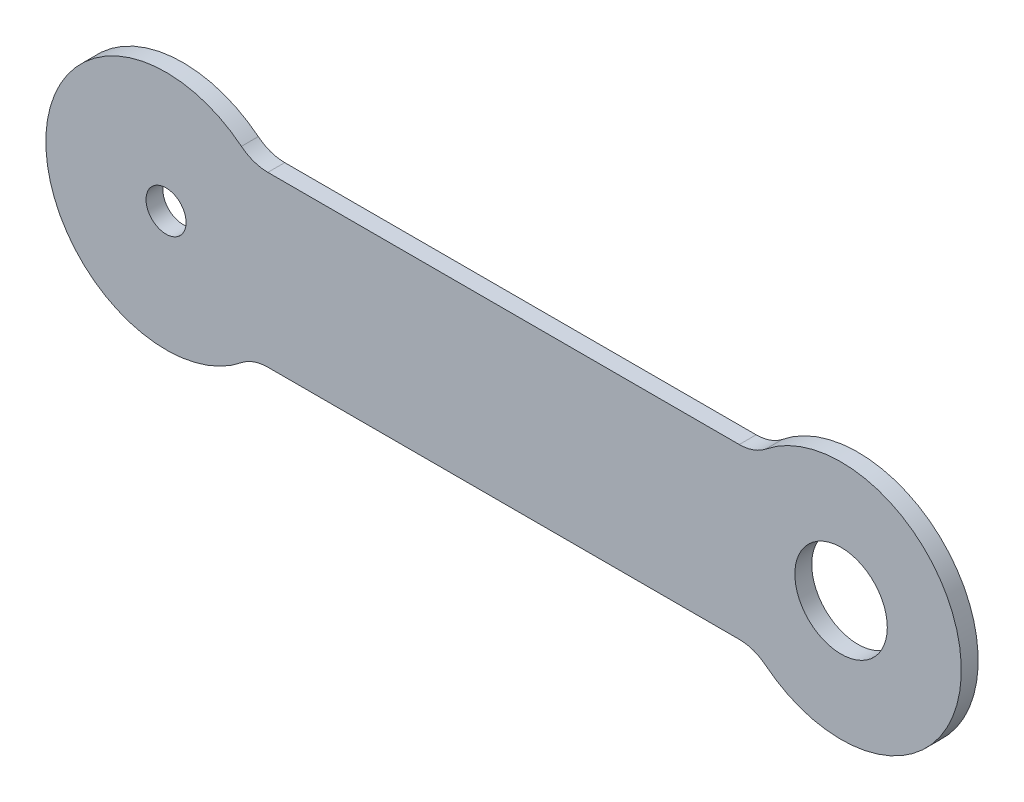
ISO-10303-21;
HEADER;
FILE_DESCRIPTION(('STEP AP214'),'2;1');
FILE_NAME('part.step','',(''),(''),'','','');
FILE_SCHEMA(('AUTOMOTIVE_DESIGN { 1 0 10303 214 1 1 1 1 }'));
ENDSEC;
DATA;
#1=APPLICATION_CONTEXT('core data for automotive mechanical design processes');
#2=APPLICATION_PROTOCOL_DEFINITION('international standard','automotive_design',2000,#1);
#3=PRODUCT_CONTEXT('',#1,'mechanical');
#4=PRODUCT('Part','Part','',(#3));
#5=PRODUCT_RELATED_PRODUCT_CATEGORY('part','',(#4));
#6=PRODUCT_DEFINITION_FORMATION('','',#4);
#7=PRODUCT_DEFINITION_CONTEXT('part definition',#1,'design');
#8=PRODUCT_DEFINITION('design','',#6,#7);
#9=PRODUCT_DEFINITION_SHAPE('','',#8);
#10=(LENGTH_UNIT() NAMED_UNIT(*) SI_UNIT(.MILLI.,.METRE.));
#11=(NAMED_UNIT(*) PLANE_ANGLE_UNIT() SI_UNIT($,.RADIAN.));
#12=(NAMED_UNIT(*) SI_UNIT($,.STERADIAN.) SOLID_ANGLE_UNIT());
#13=UNCERTAINTY_MEASURE_WITH_UNIT(LENGTH_MEASURE(1.E-05),#10,'distance_accuracy_value','');
#14=(GEOMETRIC_REPRESENTATION_CONTEXT(3) GLOBAL_UNCERTAINTY_ASSIGNED_CONTEXT((#13)) GLOBAL_UNIT_ASSIGNED_CONTEXT((#10,
#11,#12)) REPRESENTATION_CONTEXT('',''));
#15=CARTESIAN_POINT('',(0.,0.,0.));
#16=DIRECTION('',(0.,0.,1.));
#17=DIRECTION('',(1.,0.,0.));
#18=AXIS2_PLACEMENT_3D('',#15,#16,#17);
#19=CARTESIAN_POINT('',(0.,20.,0.));
#20=DIRECTION('',(0.,1.,0.));
#21=DIRECTION('',(-1.,0.,0.));
#22=AXIS2_PLACEMENT_3D('',#19,#20,#21);
#23=PLANE('',#22);
#24=DIRECTION('',(-1.,0.,0.));
#25=VECTOR('',#24,1.);
#26=CARTESIAN_POINT('',(0.,20.,0.));
#27=LINE('',#26,#25);
#28=CARTESIAN_POINT('',(55.8701429759727,20.,0.));
#29=VERTEX_POINT('',#28);
#30=CARTESIAN_POINT('',(-55.8701429759727,20.,0.));
#31=VERTEX_POINT('',#30);
#32=EDGE_CURVE('E177',#29,#31,#27,.T.);
#33=ORIENTED_EDGE('',*,*,#32,.T.);
#34=DIRECTION('',(0.,0.,-1.));
#35=VECTOR('',#34,1.);
#36=CARTESIAN_POINT('',(-55.8701429759727,20.,4.));
#37=LINE('',#36,#35);
#38=CARTESIAN_POINT('',(-55.8701429759727,20.,4.));
#39=VERTEX_POINT('',#38);
#40=EDGE_CURVE('E159',#31,#39,#37,.F.);
#41=ORIENTED_EDGE('',*,*,#40,.T.);
#42=DIRECTION('',(1.,0.,0.));
#43=VECTOR('',#42,1.);
#44=CARTESIAN_POINT('',(0.,20.,4.));
#45=LINE('',#44,#43);
#46=CARTESIAN_POINT('',(55.8701429759727,20.,4.));
#47=VERTEX_POINT('',#46);
#48=EDGE_CURVE('E186',#47,#39,#45,.F.);
#49=ORIENTED_EDGE('',*,*,#48,.F.);
#50=DIRECTION('',(0.,0.,-1.));
#51=VECTOR('',#50,1.);
#52=CARTESIAN_POINT('',(55.8701429759727,20.,0.));
#53=LINE('',#52,#51);
#54=EDGE_CURVE('E163',#47,#29,#53,.T.);
#55=ORIENTED_EDGE('',*,*,#54,.T.);
#56=EDGE_LOOP('',(#33,#41,#49,#55));
#57=FACE_BOUND('',#56,.T.);
#58=ADVANCED_FACE('F69',(#57),#23,.T.);
#59=CARTESIAN_POINT('',(80.,0.,0.));
#60=DIRECTION('',(0.,0.,1.));
#61=DIRECTION('',(1.,0.,0.));
#62=AXIS2_PLACEMENT_3D('',#59,#60,#61);
#63=CYLINDRICAL_SURFACE('',#62,28.5);
#64=CARTESIAN_POINT('',(80.,0.,0.));
#65=DIRECTION('',(0.,0.,1.));
#66=DIRECTION('',(1.,0.,0.));
#67=AXIS2_PLACEMENT_3D('',#64,#65,#66);
#68=CIRCLE('',#67,28.5);
#69=CARTESIAN_POINT('',(62.1376383068889,-22.2077922077922,0.));
#70=VERTEX_POINT('',#69);
#71=CARTESIAN_POINT('',(62.1376383068889,22.2077922077922,0.));
#72=VERTEX_POINT('',#71);
#73=EDGE_CURVE('E144',#70,#72,#68,.T.);
#74=ORIENTED_EDGE('',*,*,#73,.T.);
#75=DIRECTION('',(0.,0.,1.));
#76=VECTOR('',#75,1.);
#77=CARTESIAN_POINT('',(62.1376383068889,22.2077922077922,0.));
#78=LINE('',#77,#76);
#79=CARTESIAN_POINT('',(62.1376383068889,22.2077922077922,4.));
#80=VERTEX_POINT('',#79);
#81=EDGE_CURVE('E158',#72,#80,#78,.T.);
#82=ORIENTED_EDGE('',*,*,#81,.T.);
#83=CARTESIAN_POINT('',(80.,0.,4.));
#84=DIRECTION('',(0.,0.,1.));
#85=DIRECTION('',(1.,0.,0.));
#86=AXIS2_PLACEMENT_3D('',#83,#84,#85);
#87=CIRCLE('',#86,28.5);
#88=CARTESIAN_POINT('',(62.1376383068889,-22.2077922077922,4.));
#89=VERTEX_POINT('',#88);
#90=EDGE_CURVE('E184',#89,#80,#87,.T.);
#91=ORIENTED_EDGE('',*,*,#90,.F.);
#92=DIRECTION('',(0.,0.,1.));
#93=VECTOR('',#92,1.);
#94=CARTESIAN_POINT('',(62.1376383068889,-22.2077922077922,0.));
#95=LINE('',#94,#93);
#96=EDGE_CURVE('E156',#89,#70,#95,.F.);
#97=ORIENTED_EDGE('',*,*,#96,.T.);
#98=EDGE_LOOP('',(#74,#82,#91,#97));
#99=FACE_BOUND('',#98,.T.);
#100=ADVANCED_FACE('F228',(#99),#63,.T.);
#101=CARTESIAN_POINT('',(0.,-20.,0.));
#102=DIRECTION('',(0.,1.,0.));
#103=DIRECTION('',(-1.,0.,0.));
#104=AXIS2_PLACEMENT_3D('',#101,#102,#103);
#105=PLANE('',#104);
#106=DIRECTION('',(1.,0.,0.));
#107=VECTOR('',#106,1.);
#108=CARTESIAN_POINT('',(0.,-20.,4.));
#109=LINE('',#108,#107);
#110=CARTESIAN_POINT('',(55.8701429759727,-20.,4.));
#111=VERTEX_POINT('',#110);
#112=CARTESIAN_POINT('',(-55.8701429759727,-20.,4.));
#113=VERTEX_POINT('',#112);
#114=EDGE_CURVE('E138',#111,#113,#109,.F.);
#115=ORIENTED_EDGE('',*,*,#114,.T.);
#116=DIRECTION('',(0.,0.,1.));
#117=VECTOR('',#116,1.);
#118=CARTESIAN_POINT('',(-55.8701429759727,-20.,0.));
#119=LINE('',#118,#117);
#120=CARTESIAN_POINT('',(-55.8701429759727,-20.,0.));
#121=VERTEX_POINT('',#120);
#122=EDGE_CURVE('E143',#113,#121,#119,.F.);
#123=ORIENTED_EDGE('',*,*,#122,.T.);
#124=DIRECTION('',(-1.,0.,0.));
#125=VECTOR('',#124,1.);
#126=CARTESIAN_POINT('',(0.,-20.,0.));
#127=LINE('',#126,#125);
#128=CARTESIAN_POINT('',(55.8701429759727,-20.,0.));
#129=VERTEX_POINT('',#128);
#130=EDGE_CURVE('E141',#129,#121,#127,.T.);
#131=ORIENTED_EDGE('',*,*,#130,.F.);
#132=DIRECTION('',(0.,0.,1.));
#133=VECTOR('',#132,1.);
#134=CARTESIAN_POINT('',(55.8701429759727,-20.,4.));
#135=LINE('',#134,#133);
#136=EDGE_CURVE('E134',#129,#111,#135,.T.);
#137=ORIENTED_EDGE('',*,*,#136,.T.);
#138=EDGE_LOOP('',(#115,#123,#131,#137));
#139=FACE_BOUND('',#138,.T.);
#140=ADVANCED_FACE('F136',(#139),#105,.F.);
#141=CARTESIAN_POINT('',(-80.,0.,0.));
#142=DIRECTION('',(0.,0.,1.));
#143=DIRECTION('',(1.,0.,0.));
#144=AXIS2_PLACEMENT_3D('',#141,#142,#143);
#145=CYLINDRICAL_SURFACE('',#144,28.5);
#146=CARTESIAN_POINT('',(-80.,0.,0.));
#147=DIRECTION('',(0.,0.,1.));
#148=DIRECTION('',(1.,0.,0.));
#149=AXIS2_PLACEMENT_3D('',#146,#147,#148);
#150=CIRCLE('',#149,28.5);
#151=CARTESIAN_POINT('',(-62.1376383068889,22.2077922077922,0.));
#152=VERTEX_POINT('',#151);
#153=CARTESIAN_POINT('',(-62.1376383068889,-22.2077922077922,0.));
#154=VERTEX_POINT('',#153);
#155=EDGE_CURVE('E180',#152,#154,#150,.T.);
#156=ORIENTED_EDGE('',*,*,#155,.T.);
#157=DIRECTION('',(0.,0.,1.));
#158=VECTOR('',#157,1.);
#159=CARTESIAN_POINT('',(-62.1376383068889,-22.2077922077922,0.));
#160=LINE('',#159,#158);
#161=CARTESIAN_POINT('',(-62.1376383068889,-22.2077922077922,4.));
#162=VERTEX_POINT('',#161);
#163=EDGE_CURVE('E194',#154,#162,#160,.T.);
#164=ORIENTED_EDGE('',*,*,#163,.T.);
#165=CARTESIAN_POINT('',(-80.,0.,4.));
#166=DIRECTION('',(0.,0.,1.));
#167=DIRECTION('',(1.,0.,0.));
#168=AXIS2_PLACEMENT_3D('',#165,#166,#167);
#169=CIRCLE('',#168,28.5);
#170=CARTESIAN_POINT('',(-62.1376383068889,22.2077922077922,4.));
#171=VERTEX_POINT('',#170);
#172=EDGE_CURVE('E153',#171,#162,#169,.T.);
#173=ORIENTED_EDGE('',*,*,#172,.F.);
#174=DIRECTION('',(0.,0.,1.));
#175=VECTOR('',#174,1.);
#176=CARTESIAN_POINT('',(-62.1376383068889,22.2077922077922,0.));
#177=LINE('',#176,#175);
#178=EDGE_CURVE('E191',#171,#152,#177,.F.);
#179=ORIENTED_EDGE('',*,*,#178,.T.);
#180=EDGE_LOOP('',(#156,#164,#173,#179));
#181=FACE_BOUND('',#180,.T.);
#182=ADVANCED_FACE('F210',(#181),#145,.T.);
#183=CARTESIAN_POINT('',(0.,0.,0.));
#184=DIRECTION('',(0.,0.,1.));
#185=DIRECTION('',(1.,0.,0.));
#186=AXIS2_PLACEMENT_3D('',#183,#184,#185);
#187=PLANE('',#186);
#188=CARTESIAN_POINT('',(-80.,0.,0.));
#189=DIRECTION('',(0.,0.,1.));
#190=DIRECTION('',(1.,0.,0.));
#191=AXIS2_PLACEMENT_3D('',#188,#189,#190);
#192=CIRCLE('',#191,4.75);
#193=CARTESIAN_POINT('',(-75.25,0.,0.));
#194=VERTEX_POINT('',#193);
#195=EDGE_CURVE('E154',#194,#194,#192,.T.);
#196=ORIENTED_EDGE('',*,*,#195,.T.);
#197=EDGE_LOOP('',(#196));
#198=FACE_BOUND('',#197,.T.);
#199=CARTESIAN_POINT('',(80.,0.,0.));
#200=DIRECTION('',(0.,0.,1.));
#201=DIRECTION('',(1.,0.,0.));
#202=AXIS2_PLACEMENT_3D('',#199,#200,#201);
#203=CIRCLE('',#202,10.9584472137913);
#204=CARTESIAN_POINT('',(90.9584472137913,0.,0.));
#205=VERTEX_POINT('',#204);
#206=EDGE_CURVE('E255',#205,#205,#203,.T.);
#207=ORIENTED_EDGE('',*,*,#206,.T.);
#208=EDGE_LOOP('',(#207));
#209=FACE_BOUND('',#208,.T.);
#210=ORIENTED_EDGE('',*,*,#73,.F.);
#211=CARTESIAN_POINT('',(55.8701429759727,-30.,0.));
#212=DIRECTION('',(0.,0.,1.));
#213=DIRECTION('',(1.,0.,0.));
#214=AXIS2_PLACEMENT_3D('',#211,#212,#213);
#215=CIRCLE('',#214,10.);
#216=EDGE_CURVE('E77',#70,#129,#215,.T.);
#217=ORIENTED_EDGE('',*,*,#216,.T.);
#218=ORIENTED_EDGE('',*,*,#130,.T.);
#219=CARTESIAN_POINT('',(-55.8701429759727,-30.,0.));
#220=DIRECTION('',(0.,0.,1.));
#221=DIRECTION('',(1.,0.,0.));
#222=AXIS2_PLACEMENT_3D('',#219,#220,#221);
#223=CIRCLE('',#222,10.);
#224=EDGE_CURVE('E161',#121,#154,#223,.T.);
#225=ORIENTED_EDGE('',*,*,#224,.T.);
#226=ORIENTED_EDGE('',*,*,#155,.F.);
#227=CARTESIAN_POINT('',(-55.8701429759727,30.,0.));
#228=DIRECTION('',(0.,0.,1.));
#229=DIRECTION('',(1.,0.,0.));
#230=AXIS2_PLACEMENT_3D('',#227,#228,#229);
#231=CIRCLE('',#230,10.);
#232=EDGE_CURVE('E169',#152,#31,#231,.T.);
#233=ORIENTED_EDGE('',*,*,#232,.T.);
#234=ORIENTED_EDGE('',*,*,#32,.F.);
#235=CARTESIAN_POINT('',(55.8701429759727,30.,0.));
#236=DIRECTION('',(0.,0.,1.));
#237=DIRECTION('',(1.,0.,0.));
#238=AXIS2_PLACEMENT_3D('',#235,#236,#237);
#239=CIRCLE('',#238,10.);
#240=EDGE_CURVE('E84',#29,#72,#239,.T.);
#241=ORIENTED_EDGE('',*,*,#240,.T.);
#242=EDGE_LOOP('',(#210,#217,#218,#225,#226,#233,#234,#241));
#243=FACE_BOUND('',#242,.T.);
#244=ADVANCED_FACE('F175',(#198,#209,#243),#187,.F.);
#245=CARTESIAN_POINT('',(0.,0.,4.));
#246=DIRECTION('',(0.,0.,1.));
#247=DIRECTION('',(1.,0.,0.));
#248=AXIS2_PLACEMENT_3D('',#245,#246,#247);
#249=PLANE('',#248);
#250=CARTESIAN_POINT('',(-80.,0.,4.));
#251=DIRECTION('',(0.,0.,1.));
#252=DIRECTION('',(1.,0.,0.));
#253=AXIS2_PLACEMENT_3D('',#250,#251,#252);
#254=CIRCLE('',#253,4.75);
#255=CARTESIAN_POINT('',(-75.25,0.,4.));
#256=VERTEX_POINT('',#255);
#257=EDGE_CURVE('E261',#256,#256,#254,.T.);
#258=ORIENTED_EDGE('',*,*,#257,.F.);
#259=EDGE_LOOP('',(#258));
#260=FACE_BOUND('',#259,.T.);
#261=CARTESIAN_POINT('',(80.,0.,4.));
#262=DIRECTION('',(0.,0.,1.));
#263=DIRECTION('',(1.,0.,0.));
#264=AXIS2_PLACEMENT_3D('',#261,#262,#263);
#265=CIRCLE('',#264,10.9584472137913);
#266=CARTESIAN_POINT('',(90.9584472137913,0.,4.));
#267=VERTEX_POINT('',#266);
#268=EDGE_CURVE('E258',#267,#267,#265,.T.);
#269=ORIENTED_EDGE('',*,*,#268,.F.);
#270=EDGE_LOOP('',(#269));
#271=FACE_BOUND('',#270,.T.);
#272=ORIENTED_EDGE('',*,*,#114,.F.);
#273=CARTESIAN_POINT('',(55.8701429759727,-30.,4.));
#274=DIRECTION('',(0.,0.,1.));
#275=DIRECTION('',(1.,0.,0.));
#276=AXIS2_PLACEMENT_3D('',#273,#274,#275);
#277=CIRCLE('',#276,10.);
#278=EDGE_CURVE('E12',#111,#89,#277,.F.);
#279=ORIENTED_EDGE('',*,*,#278,.T.);
#280=ORIENTED_EDGE('',*,*,#90,.T.);
#281=CARTESIAN_POINT('',(55.8701429759727,30.,4.));
#282=DIRECTION('',(0.,0.,1.));
#283=DIRECTION('',(1.,0.,0.));
#284=AXIS2_PLACEMENT_3D('',#281,#282,#283);
#285=CIRCLE('',#284,10.);
#286=EDGE_CURVE('E174',#80,#47,#285,.F.);
#287=ORIENTED_EDGE('',*,*,#286,.T.);
#288=ORIENTED_EDGE('',*,*,#48,.T.);
#289=CARTESIAN_POINT('',(-55.8701429759727,30.,4.));
#290=DIRECTION('',(0.,0.,1.));
#291=DIRECTION('',(1.,0.,0.));
#292=AXIS2_PLACEMENT_3D('',#289,#290,#291);
#293=CIRCLE('',#292,10.);
#294=EDGE_CURVE('E171',#39,#171,#293,.F.);
#295=ORIENTED_EDGE('',*,*,#294,.T.);
#296=ORIENTED_EDGE('',*,*,#172,.T.);
#297=CARTESIAN_POINT('',(-55.8701429759727,-30.,4.));
#298=DIRECTION('',(0.,0.,1.));
#299=DIRECTION('',(1.,0.,0.));
#300=AXIS2_PLACEMENT_3D('',#297,#298,#299);
#301=CIRCLE('',#300,10.);
#302=EDGE_CURVE('E152',#162,#113,#301,.F.);
#303=ORIENTED_EDGE('',*,*,#302,.T.);
#304=EDGE_LOOP('',(#272,#279,#280,#287,#288,#295,#296,#303));
#305=FACE_BOUND('',#304,.T.);
#306=ADVANCED_FACE('F147',(#260,#271,#305),#249,.T.);
#307=CARTESIAN_POINT('',(80.,0.,0.));
#308=DIRECTION('',(0.,0.,1.));
#309=DIRECTION('',(1.,0.,0.));
#310=AXIS2_PLACEMENT_3D('',#307,#308,#309);
#311=CYLINDRICAL_SURFACE('',#310,10.9584472137913);
#312=ORIENTED_EDGE('',*,*,#206,.F.);
#313=EDGE_LOOP('',(#312));
#314=FACE_BOUND('',#313,.T.);
#315=ORIENTED_EDGE('',*,*,#268,.T.);
#316=EDGE_LOOP('',(#315));
#317=FACE_BOUND('',#316,.T.);
#318=ADVANCED_FACE('F223',(#314,#317),#311,.F.);
#319=CARTESIAN_POINT('',(-80.,0.,0.));
#320=DIRECTION('',(0.,0.,1.));
#321=DIRECTION('',(1.,0.,0.));
#322=AXIS2_PLACEMENT_3D('',#319,#320,#321);
#323=CYLINDRICAL_SURFACE('',#322,4.75);
#324=ORIENTED_EDGE('',*,*,#195,.F.);
#325=EDGE_LOOP('',(#324));
#326=FACE_BOUND('',#325,.T.);
#327=ORIENTED_EDGE('',*,*,#257,.T.);
#328=EDGE_LOOP('',(#327));
#329=FACE_BOUND('',#328,.T.);
#330=ADVANCED_FACE('F215',(#326,#329),#323,.F.);
#331=CARTESIAN_POINT('',(-55.8701429759727,-30.,0.));
#332=DIRECTION('',(0.,0.,1.));
#333=DIRECTION('',(1.,0.,0.));
#334=AXIS2_PLACEMENT_3D('',#331,#332,#333);
#335=CYLINDRICAL_SURFACE('',#334,10.);
#336=ORIENTED_EDGE('',*,*,#302,.F.);
#337=ORIENTED_EDGE('',*,*,#163,.F.);
#338=ORIENTED_EDGE('',*,*,#224,.F.);
#339=ORIENTED_EDGE('',*,*,#122,.F.);
#340=EDGE_LOOP('',(#336,#337,#338,#339));
#341=FACE_BOUND('',#340,.T.);
#342=ADVANCED_FACE('F213',(#341),#335,.F.);
#343=CARTESIAN_POINT('',(-55.8701429759727,30.,0.));
#344=DIRECTION('',(0.,0.,1.));
#345=DIRECTION('',(1.,0.,0.));
#346=AXIS2_PLACEMENT_3D('',#343,#344,#345);
#347=CYLINDRICAL_SURFACE('',#346,10.);
#348=ORIENTED_EDGE('',*,*,#294,.F.);
#349=ORIENTED_EDGE('',*,*,#40,.F.);
#350=ORIENTED_EDGE('',*,*,#232,.F.);
#351=ORIENTED_EDGE('',*,*,#178,.F.);
#352=EDGE_LOOP('',(#348,#349,#350,#351));
#353=FACE_BOUND('',#352,.T.);
#354=ADVANCED_FACE('F207',(#353),#347,.F.);
#355=CARTESIAN_POINT('',(55.8701429759727,30.,0.));
#356=DIRECTION('',(0.,0.,1.));
#357=DIRECTION('',(1.,0.,0.));
#358=AXIS2_PLACEMENT_3D('',#355,#356,#357);
#359=CYLINDRICAL_SURFACE('',#358,10.);
#360=ORIENTED_EDGE('',*,*,#286,.F.);
#361=ORIENTED_EDGE('',*,*,#81,.F.);
#362=ORIENTED_EDGE('',*,*,#240,.F.);
#363=ORIENTED_EDGE('',*,*,#54,.F.);
#364=EDGE_LOOP('',(#360,#361,#362,#363));
#365=FACE_BOUND('',#364,.T.);
#366=ADVANCED_FACE('F221',(#365),#359,.F.);
#367=CARTESIAN_POINT('',(55.8701429759727,-30.,0.));
#368=DIRECTION('',(0.,0.,1.));
#369=DIRECTION('',(1.,0.,0.));
#370=AXIS2_PLACEMENT_3D('',#367,#368,#369);
#371=CYLINDRICAL_SURFACE('',#370,10.);
#372=ORIENTED_EDGE('',*,*,#278,.F.);
#373=ORIENTED_EDGE('',*,*,#136,.F.);
#374=ORIENTED_EDGE('',*,*,#216,.F.);
#375=ORIENTED_EDGE('',*,*,#96,.F.);
#376=EDGE_LOOP('',(#372,#373,#374,#375));
#377=FACE_BOUND('',#376,.T.);
#378=ADVANCED_FACE('F71',(#377),#371,.F.);
#379=CLOSED_SHELL('',(#58,#100,#140,#182,#244,#306,#318,#330,#342,#354,#366,#378));
#380=MANIFOLD_SOLID_BREP('B2',#379);
#381=ADVANCED_BREP_SHAPE_REPRESENTATION('',(#18,#380),#14);
#382=SHAPE_DEFINITION_REPRESENTATION(#9,#381);
ENDSEC;
END-ISO-10303-21;
